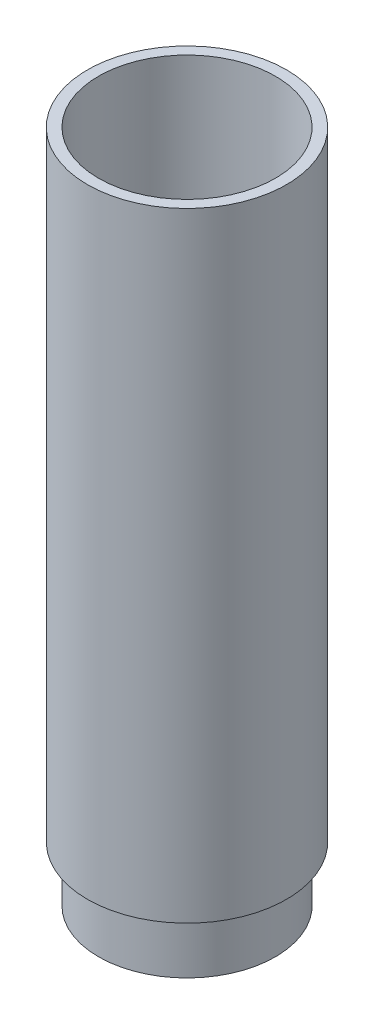
ISO-10303-21;
HEADER;
FILE_DESCRIPTION(('STEP AP214'),'2;1');
FILE_NAME('part.step','',(''),(''),'','','');
FILE_SCHEMA(('AUTOMOTIVE_DESIGN { 1 0 10303 214 1 1 1 1 }'));
ENDSEC;
DATA;
#1=APPLICATION_CONTEXT('core data for automotive mechanical design processes');
#2=APPLICATION_PROTOCOL_DEFINITION('international standard','automotive_design',2000,#1);
#3=PRODUCT_CONTEXT('',#1,'mechanical');
#4=PRODUCT('Part','Part','',(#3));
#5=PRODUCT_RELATED_PRODUCT_CATEGORY('part','',(#4));
#6=PRODUCT_DEFINITION_FORMATION('','',#4);
#7=PRODUCT_DEFINITION_CONTEXT('part definition',#1,'design');
#8=PRODUCT_DEFINITION('design','',#6,#7);
#9=PRODUCT_DEFINITION_SHAPE('','',#8);
#10=(LENGTH_UNIT() NAMED_UNIT(*) SI_UNIT(.MILLI.,.METRE.));
#11=(NAMED_UNIT(*) PLANE_ANGLE_UNIT() SI_UNIT($,.RADIAN.));
#12=(NAMED_UNIT(*) SI_UNIT($,.STERADIAN.) SOLID_ANGLE_UNIT());
#13=UNCERTAINTY_MEASURE_WITH_UNIT(LENGTH_MEASURE(1.E-05),#10,'distance_accuracy_value','');
#14=(GEOMETRIC_REPRESENTATION_CONTEXT(3) GLOBAL_UNCERTAINTY_ASSIGNED_CONTEXT((#13)) GLOBAL_UNIT_ASSIGNED_CONTEXT((#10,
#11,#12)) REPRESENTATION_CONTEXT('',''));
#15=CARTESIAN_POINT('',(0.,0.,0.));
#16=DIRECTION('',(0.,0.,1.));
#17=DIRECTION('',(1.,0.,0.));
#18=AXIS2_PLACEMENT_3D('',#15,#16,#17);
#19=CARTESIAN_POINT('',(0.,130.,0.));
#20=DIRECTION('',(0.,-1.,0.));
#21=DIRECTION('',(0.,0.,-1.));
#22=AXIS2_PLACEMENT_3D('',#19,#20,#21);
#23=CYLINDRICAL_SURFACE('',#22,9.);
#24=CARTESIAN_POINT('',(0.,10.,0.));
#25=DIRECTION('',(0.,1.,0.));
#26=DIRECTION('',(0.,0.,1.));
#27=AXIS2_PLACEMENT_3D('',#24,#25,#26);
#28=CIRCLE('',#27,9.);
#29=CARTESIAN_POINT('',(0.,10.,9.));
#30=VERTEX_POINT('',#29);
#31=EDGE_CURVE('E56',#30,#30,#28,.T.);
#32=ORIENTED_EDGE('',*,*,#31,.T.);
#33=EDGE_LOOP('',(#32));
#34=FACE_BOUND('',#33,.T.);
#35=CARTESIAN_POINT('',(0.,65.9800779737888,0.));
#36=DIRECTION('',(0.,1.,0.));
#37=DIRECTION('',(0.,0.,1.));
#38=AXIS2_PLACEMENT_3D('',#35,#36,#37);
#39=CIRCLE('',#38,9.);
#40=CARTESIAN_POINT('',(0.,65.9800779737888,9.));
#41=VERTEX_POINT('',#40);
#42=EDGE_CURVE('E68',#41,#41,#39,.T.);
#43=ORIENTED_EDGE('',*,*,#42,.F.);
#44=EDGE_LOOP('',(#43));
#45=FACE_BOUND('',#44,.T.);
#46=ADVANCED_FACE('F36',(#34,#45),#23,.T.);
#47=CARTESIAN_POINT('',(0.,130.,0.));
#48=DIRECTION('',(0.,-1.,0.));
#49=DIRECTION('',(0.,0.,-1.));
#50=AXIS2_PLACEMENT_3D('',#47,#48,#49);
#51=CYLINDRICAL_SURFACE('',#50,8.);
#52=CARTESIAN_POINT('',(0.,15.,0.));
#53=DIRECTION('',(0.,1.,0.));
#54=DIRECTION('',(0.,0.,1.));
#55=AXIS2_PLACEMENT_3D('',#52,#53,#54);
#56=CIRCLE('',#55,8.);
#57=CARTESIAN_POINT('',(0.,15.,8.));
#58=VERTEX_POINT('',#57);
#59=EDGE_CURVE('E50',#58,#58,#56,.F.);
#60=ORIENTED_EDGE('',*,*,#59,.T.);
#61=EDGE_LOOP('',(#60));
#62=FACE_BOUND('',#61,.T.);
#63=CARTESIAN_POINT('',(0.,65.9800779737888,0.));
#64=DIRECTION('',(0.,1.,0.));
#65=DIRECTION('',(0.,0.,1.));
#66=AXIS2_PLACEMENT_3D('',#63,#64,#65);
#67=CIRCLE('',#66,8.);
#68=CARTESIAN_POINT('',(0.,65.9800779737888,8.));
#69=VERTEX_POINT('',#68);
#70=EDGE_CURVE('E40',#69,#69,#67,.T.);
#71=ORIENTED_EDGE('',*,*,#70,.T.);
#72=EDGE_LOOP('',(#71));
#73=FACE_BOUND('',#72,.T.);
#74=ADVANCED_FACE('F77',(#62,#73),#51,.F.);
#75=CARTESIAN_POINT('',(0.,15.,0.));
#76=DIRECTION('',(0.,-1.,0.));
#77=DIRECTION('',(0.,0.,-1.));
#78=AXIS2_PLACEMENT_3D('',#75,#76,#77);
#79=CYLINDRICAL_SURFACE('',#78,8.);
#80=CARTESIAN_POINT('',(0.,4.99999999999996,0.));
#81=DIRECTION('',(0.,1.,0.));
#82=DIRECTION('',(0.,0.,1.));
#83=AXIS2_PLACEMENT_3D('',#80,#81,#82);
#84=CIRCLE('',#83,8.);
#85=CARTESIAN_POINT('',(0.,4.99999999999996,8.));
#86=VERTEX_POINT('',#85);
#87=EDGE_CURVE('E60',#86,#86,#84,.T.);
#88=ORIENTED_EDGE('',*,*,#87,.T.);
#89=EDGE_LOOP('',(#88));
#90=FACE_BOUND('',#89,.T.);
#91=CARTESIAN_POINT('',(0.,10.,0.));
#92=DIRECTION('',(0.,1.,0.));
#93=DIRECTION('',(0.,0.,1.));
#94=AXIS2_PLACEMENT_3D('',#91,#92,#93);
#95=CIRCLE('',#94,8.);
#96=CARTESIAN_POINT('',(0.,10.,8.));
#97=VERTEX_POINT('',#96);
#98=EDGE_CURVE('E10',#97,#97,#95,.T.);
#99=ORIENTED_EDGE('',*,*,#98,.F.);
#100=EDGE_LOOP('',(#99));
#101=FACE_BOUND('',#100,.T.);
#102=ADVANCED_FACE('F38',(#90,#101),#79,.T.);
#103=CARTESIAN_POINT('',(0.,15.,0.));
#104=DIRECTION('',(0.,1.,0.));
#105=DIRECTION('',(0.,0.,1.));
#106=AXIS2_PLACEMENT_3D('',#103,#104,#105);
#107=PLANE('',#106);
#108=ORIENTED_EDGE('',*,*,#59,.F.);
#109=EDGE_LOOP('',(#108));
#110=FACE_BOUND('',#109,.T.);
#111=CARTESIAN_POINT('',(0.,15.,0.));
#112=DIRECTION('',(0.,1.,0.));
#113=DIRECTION('',(0.,0.,1.));
#114=AXIS2_PLACEMENT_3D('',#111,#112,#113);
#115=CIRCLE('',#114,7.);
#116=CARTESIAN_POINT('',(0.,15.,7.));
#117=VERTEX_POINT('',#116);
#118=EDGE_CURVE('E45',#117,#117,#115,.T.);
#119=ORIENTED_EDGE('',*,*,#118,.F.);
#120=EDGE_LOOP('',(#119));
#121=FACE_BOUND('',#120,.T.);
#122=ADVANCED_FACE('F103',(#110,#121),#107,.T.);
#123=CARTESIAN_POINT('',(0.,15.,0.));
#124=DIRECTION('',(0.,-1.,0.));
#125=DIRECTION('',(0.,0.,-1.));
#126=AXIS2_PLACEMENT_3D('',#123,#124,#125);
#127=CYLINDRICAL_SURFACE('',#126,7.);
#128=CARTESIAN_POINT('',(0.,4.99999999999996,0.));
#129=DIRECTION('',(0.,1.,0.));
#130=DIRECTION('',(0.,0.,1.));
#131=AXIS2_PLACEMENT_3D('',#128,#129,#130);
#132=CIRCLE('',#131,7.);
#133=CARTESIAN_POINT('',(0.,4.99999999999996,7.));
#134=VERTEX_POINT('',#133);
#135=EDGE_CURVE('E64',#134,#134,#132,.T.);
#136=ORIENTED_EDGE('',*,*,#135,.F.);
#137=EDGE_LOOP('',(#136));
#138=FACE_BOUND('',#137,.T.);
#139=ORIENTED_EDGE('',*,*,#118,.T.);
#140=EDGE_LOOP('',(#139));
#141=FACE_BOUND('',#140,.T.);
#142=ADVANCED_FACE('F101',(#138,#141),#127,.F.);
#143=CARTESIAN_POINT('',(0.,10.,0.));
#144=DIRECTION('',(0.,1.,0.));
#145=DIRECTION('',(0.,0.,1.));
#146=AXIS2_PLACEMENT_3D('',#143,#144,#145);
#147=PLANE('',#146);
#148=ORIENTED_EDGE('',*,*,#31,.F.);
#149=EDGE_LOOP('',(#148));
#150=FACE_BOUND('',#149,.T.);
#151=ORIENTED_EDGE('',*,*,#98,.T.);
#152=EDGE_LOOP('',(#151));
#153=FACE_BOUND('',#152,.T.);
#154=ADVANCED_FACE('F87',(#150,#153),#147,.F.);
#155=CARTESIAN_POINT('',(0.,4.99999999999996,0.));
#156=DIRECTION('',(0.,1.,0.));
#157=DIRECTION('',(0.,0.,1.));
#158=AXIS2_PLACEMENT_3D('',#155,#156,#157);
#159=PLANE('',#158);
#160=ORIENTED_EDGE('',*,*,#87,.F.);
#161=EDGE_LOOP('',(#160));
#162=FACE_BOUND('',#161,.T.);
#163=ORIENTED_EDGE('',*,*,#135,.T.);
#164=EDGE_LOOP('',(#163));
#165=FACE_BOUND('',#164,.T.);
#166=ADVANCED_FACE('F81',(#162,#165),#159,.F.);
#167=CARTESIAN_POINT('',(9.,65.9800779737888,31.));
#168=DIRECTION('',(0.,1.,0.));
#169=DIRECTION('',(0.,0.,1.));
#170=AXIS2_PLACEMENT_3D('',#167,#168,#169);
#171=PLANE('',#170);
#172=ORIENTED_EDGE('',*,*,#70,.F.);
#173=EDGE_LOOP('',(#172));
#174=FACE_BOUND('',#173,.T.);
#175=ORIENTED_EDGE('',*,*,#42,.T.);
#176=EDGE_LOOP('',(#175));
#177=FACE_BOUND('',#176,.T.);
#178=ADVANCED_FACE('F79',(#174,#177),#171,.T.);
#179=CLOSED_SHELL('',(#46,#74,#102,#122,#142,#154,#166,#178));
#180=MANIFOLD_SOLID_BREP('B2',#179);
#181=ADVANCED_BREP_SHAPE_REPRESENTATION('',(#18,#180),#14);
#182=SHAPE_DEFINITION_REPRESENTATION(#9,#181);
ENDSEC;
END-ISO-10303-21;
